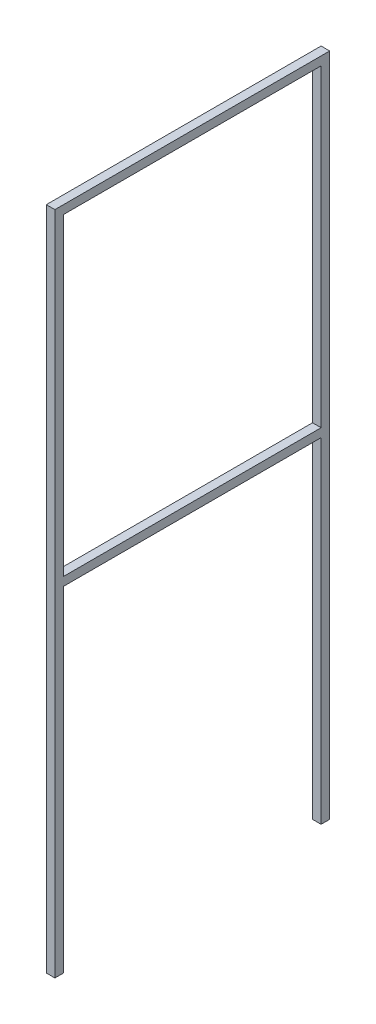
ISO-10303-21;
HEADER;
FILE_DESCRIPTION(('STEP AP214'),'2;1');
FILE_NAME('part.step','',(''),(''),'','','');
FILE_SCHEMA(('AUTOMOTIVE_DESIGN { 1 0 10303 214 1 1 1 1 }'));
ENDSEC;
DATA;
#1=APPLICATION_CONTEXT('core data for automotive mechanical design processes');
#2=APPLICATION_PROTOCOL_DEFINITION('international standard','automotive_design',2000,#1);
#3=PRODUCT_CONTEXT('',#1,'mechanical');
#4=PRODUCT('Part','Part','',(#3));
#5=PRODUCT_RELATED_PRODUCT_CATEGORY('part','',(#4));
#6=PRODUCT_DEFINITION_FORMATION('','',#4);
#7=PRODUCT_DEFINITION_CONTEXT('part definition',#1,'design');
#8=PRODUCT_DEFINITION('design','',#6,#7);
#9=PRODUCT_DEFINITION_SHAPE('','',#8);
#10=(LENGTH_UNIT() NAMED_UNIT(*) SI_UNIT(.MILLI.,.METRE.));
#11=(NAMED_UNIT(*) PLANE_ANGLE_UNIT() SI_UNIT($,.RADIAN.));
#12=(NAMED_UNIT(*) SI_UNIT($,.STERADIAN.) SOLID_ANGLE_UNIT());
#13=UNCERTAINTY_MEASURE_WITH_UNIT(LENGTH_MEASURE(1.E-05),#10,'distance_accuracy_value','');
#14=(GEOMETRIC_REPRESENTATION_CONTEXT(3) GLOBAL_UNCERTAINTY_ASSIGNED_CONTEXT((#13)) GLOBAL_UNIT_ASSIGNED_CONTEXT((#10,
#11,#12)) REPRESENTATION_CONTEXT('',''));
#15=CARTESIAN_POINT('',(0.,0.,0.));
#16=DIRECTION('',(0.,0.,1.));
#17=DIRECTION('',(1.,0.,0.));
#18=AXIS2_PLACEMENT_3D('',#15,#16,#17);
#19=CARTESIAN_POINT('',(20.,2.89623397728302E-13,600.));
#20=DIRECTION('',(0.,0.,-1.));
#21=DIRECTION('',(0.,1.,0.));
#22=AXIS2_PLACEMENT_3D('',#19,#20,#21);
#23=PLANE('',#22);
#24=DIRECTION('',(0.,-1.,0.));
#25=VECTOR('',#24,1.);
#26=CARTESIAN_POINT('',(0.,2.89623397728302E-13,600.));
#27=LINE('',#26,#25);
#28=CARTESIAN_POINT('',(0.,230.,600.));
#29=VERTEX_POINT('',#28);
#30=CARTESIAN_POINT('',(0.,-500.,600.));
#31=VERTEX_POINT('',#30);
#32=EDGE_CURVE('E178',#29,#31,#27,.T.);
#33=ORIENTED_EDGE('',*,*,#32,.F.);
#34=DIRECTION('',(-1.,0.,0.));
#35=VECTOR('',#34,1.);
#36=CARTESIAN_POINT('',(20.,230.,600.));
#37=LINE('',#36,#35);
#38=CARTESIAN_POINT('',(20.,230.,600.));
#39=VERTEX_POINT('',#38);
#40=EDGE_CURVE('E11',#39,#29,#37,.T.);
#41=ORIENTED_EDGE('',*,*,#40,.F.);
#42=DIRECTION('',(0.,-1.,0.));
#43=VECTOR('',#42,1.);
#44=CARTESIAN_POINT('',(20.,2.89623397728302E-13,600.));
#45=LINE('',#44,#43);
#46=CARTESIAN_POINT('',(20.,-500.,600.));
#47=VERTEX_POINT('',#46);
#48=EDGE_CURVE('E137',#39,#47,#45,.T.);
#49=ORIENTED_EDGE('',*,*,#48,.T.);
#50=DIRECTION('',(-1.,0.,0.));
#51=VECTOR('',#50,1.);
#52=CARTESIAN_POINT('',(20.,-500.,600.));
#53=LINE('',#52,#51);
#54=EDGE_CURVE('E99',#47,#31,#53,.T.);
#55=ORIENTED_EDGE('',*,*,#54,.T.);
#56=EDGE_LOOP('',(#33,#41,#49,#55));
#57=FACE_BOUND('',#56,.T.);
#58=ADVANCED_FACE('F34',(#57),#23,.T.);
#59=CARTESIAN_POINT('',(20.,230.,0.));
#60=DIRECTION('',(0.,1.,0.));
#61=DIRECTION('',(0.,0.,1.));
#62=AXIS2_PLACEMENT_3D('',#59,#60,#61);
#63=PLANE('',#62);
#64=DIRECTION('',(0.,0.,-1.));
#65=VECTOR('',#64,1.);
#66=CARTESIAN_POINT('',(0.,230.,0.));
#67=LINE('',#66,#65);
#68=CARTESIAN_POINT('',(0.,230.,0.));
#69=VERTEX_POINT('',#68);
#70=EDGE_CURVE('E143',#29,#69,#67,.T.);
#71=ORIENTED_EDGE('',*,*,#70,.T.);
#72=DIRECTION('',(-1.,0.,0.));
#73=VECTOR('',#72,1.);
#74=CARTESIAN_POINT('',(20.,230.,0.));
#75=LINE('',#74,#73);
#76=CARTESIAN_POINT('',(20.,230.,0.));
#77=VERTEX_POINT('',#76);
#78=EDGE_CURVE('E44',#77,#69,#75,.T.);
#79=ORIENTED_EDGE('',*,*,#78,.F.);
#80=DIRECTION('',(0.,0.,-1.));
#81=VECTOR('',#80,1.);
#82=CARTESIAN_POINT('',(20.,230.,0.));
#83=LINE('',#82,#81);
#84=EDGE_CURVE('E132',#39,#77,#83,.T.);
#85=ORIENTED_EDGE('',*,*,#84,.F.);
#86=ORIENTED_EDGE('',*,*,#40,.T.);
#87=EDGE_LOOP('',(#71,#79,#85,#86));
#88=FACE_BOUND('',#87,.T.);
#89=ADVANCED_FACE('F141',(#88),#63,.F.);
#90=CARTESIAN_POINT('',(20.,0.,0.));
#91=DIRECTION('',(0.,0.,1.));
#92=DIRECTION('',(1.,0.,0.));
#93=AXIS2_PLACEMENT_3D('',#90,#91,#92);
#94=PLANE('',#93);
#95=DIRECTION('',(0.,1.,0.));
#96=VECTOR('',#95,1.);
#97=CARTESIAN_POINT('',(0.,0.,0.));
#98=LINE('',#97,#96);
#99=CARTESIAN_POINT('',(0.,-500.,0.));
#100=VERTEX_POINT('',#99);
#101=EDGE_CURVE('E182',#100,#69,#98,.T.);
#102=ORIENTED_EDGE('',*,*,#101,.F.);
#103=DIRECTION('',(-1.,0.,0.));
#104=VECTOR('',#103,1.);
#105=CARTESIAN_POINT('',(20.,-500.,0.));
#106=LINE('',#105,#104);
#107=CARTESIAN_POINT('',(20.,-500.,0.));
#108=VERTEX_POINT('',#107);
#109=EDGE_CURVE('E92',#108,#100,#106,.T.);
#110=ORIENTED_EDGE('',*,*,#109,.F.);
#111=DIRECTION('',(0.,1.,0.));
#112=VECTOR('',#111,1.);
#113=CARTESIAN_POINT('',(20.,0.,0.));
#114=LINE('',#113,#112);
#115=EDGE_CURVE('E136',#108,#77,#114,.T.);
#116=ORIENTED_EDGE('',*,*,#115,.T.);
#117=ORIENTED_EDGE('',*,*,#78,.T.);
#118=EDGE_LOOP('',(#102,#110,#116,#117));
#119=FACE_BOUND('',#118,.T.);
#120=ADVANCED_FACE('F148',(#119),#94,.T.);
#121=CARTESIAN_POINT('',(20.,249.999999999999,-1.04083408558608E-12));
#122=DIRECTION('',(0.,1.,0.));
#123=DIRECTION('',(0.,0.,1.));
#124=AXIS2_PLACEMENT_3D('',#121,#122,#123);
#125=PLANE('',#124);
#126=DIRECTION('',(0.,0.,-1.));
#127=VECTOR('',#126,1.);
#128=CARTESIAN_POINT('',(0.,249.999999999999,-1.04083408558608E-12));
#129=LINE('',#128,#127);
#130=CARTESIAN_POINT('',(0.,250.,619.999999999999));
#131=VERTEX_POINT('',#130);
#132=CARTESIAN_POINT('',(0.,249.999999999999,-20.0000000000006));
#133=VERTEX_POINT('',#132);
#134=EDGE_CURVE('E154',#131,#133,#129,.T.);
#135=ORIENTED_EDGE('',*,*,#134,.F.);
#136=DIRECTION('',(-1.,0.,0.));
#137=VECTOR('',#136,1.);
#138=CARTESIAN_POINT('',(20.,250.,619.999999999999));
#139=LINE('',#138,#137);
#140=CARTESIAN_POINT('',(20.,250.,619.999999999999));
#141=VERTEX_POINT('',#140);
#142=EDGE_CURVE('E38',#141,#131,#139,.T.);
#143=ORIENTED_EDGE('',*,*,#142,.F.);
#144=DIRECTION('',(0.,0.,-1.));
#145=VECTOR('',#144,1.);
#146=CARTESIAN_POINT('',(20.,249.999999999999,-1.04083408558608E-12));
#147=LINE('',#146,#145);
#148=CARTESIAN_POINT('',(20.,249.999999999999,-20.0000000000006));
#149=VERTEX_POINT('',#148);
#150=EDGE_CURVE('E186',#141,#149,#147,.T.);
#151=ORIENTED_EDGE('',*,*,#150,.T.);
#152=DIRECTION('',(-1.,0.,0.));
#153=VECTOR('',#152,1.);
#154=CARTESIAN_POINT('',(20.,249.999999999999,-20.0000000000006));
#155=LINE('',#154,#153);
#156=EDGE_CURVE('E150',#149,#133,#155,.T.);
#157=ORIENTED_EDGE('',*,*,#156,.T.);
#158=EDGE_LOOP('',(#135,#143,#151,#157));
#159=FACE_BOUND('',#158,.T.);
#160=ADVANCED_FACE('F36',(#159),#125,.T.);
#161=CARTESIAN_POINT('',(20.,1.37667655053519E-12,620.));
#162=DIRECTION('',(0.,0.,-1.));
#163=DIRECTION('',(0.,1.,0.));
#164=AXIS2_PLACEMENT_3D('',#161,#162,#163);
#165=PLANE('',#164);
#166=DIRECTION('',(0.,-1.,0.));
#167=VECTOR('',#166,1.);
#168=CARTESIAN_POINT('',(0.,1.37667655053519E-12,620.));
#169=LINE('',#168,#167);
#170=CARTESIAN_POINT('',(0.,-1300.,620.));
#171=VERTEX_POINT('',#170);
#172=EDGE_CURVE('E157',#131,#171,#169,.T.);
#173=ORIENTED_EDGE('',*,*,#172,.T.);
#174=DIRECTION('',(-1.,0.,0.));
#175=VECTOR('',#174,1.);
#176=CARTESIAN_POINT('',(20.,-1300.,620.));
#177=LINE('',#176,#175);
#178=CARTESIAN_POINT('',(20.,-1300.,620.));
#179=VERTEX_POINT('',#178);
#180=EDGE_CURVE('E199',#179,#171,#177,.T.);
#181=ORIENTED_EDGE('',*,*,#180,.F.);
#182=DIRECTION('',(0.,-1.,0.));
#183=VECTOR('',#182,1.);
#184=CARTESIAN_POINT('',(20.,1.37667655053519E-12,620.));
#185=LINE('',#184,#183);
#186=EDGE_CURVE('E207',#141,#179,#185,.T.);
#187=ORIENTED_EDGE('',*,*,#186,.F.);
#188=ORIENTED_EDGE('',*,*,#142,.T.);
#189=EDGE_LOOP('',(#173,#181,#187,#188));
#190=FACE_BOUND('',#189,.T.);
#191=ADVANCED_FACE('F206',(#190),#165,.F.);
#192=CARTESIAN_POINT('',(20.,-1300.,0.));
#193=DIRECTION('',(0.,-1.,0.));
#194=DIRECTION('',(0.,0.,-1.));
#195=AXIS2_PLACEMENT_3D('',#192,#193,#194);
#196=PLANE('',#195);
#197=DIRECTION('',(0.,0.,1.));
#198=VECTOR('',#197,1.);
#199=CARTESIAN_POINT('',(0.,-1300.,0.));
#200=LINE('',#199,#198);
#201=CARTESIAN_POINT('',(0.,-1300.,600.));
#202=VERTEX_POINT('',#201);
#203=EDGE_CURVE('E160',#202,#171,#200,.T.);
#204=ORIENTED_EDGE('',*,*,#203,.F.);
#205=DIRECTION('',(-1.,0.,0.));
#206=VECTOR('',#205,1.);
#207=CARTESIAN_POINT('',(20.,-1300.,600.));
#208=LINE('',#207,#206);
#209=CARTESIAN_POINT('',(20.,-1300.,600.));
#210=VERTEX_POINT('',#209);
#211=EDGE_CURVE('E198',#210,#202,#208,.T.);
#212=ORIENTED_EDGE('',*,*,#211,.F.);
#213=DIRECTION('',(0.,0.,1.));
#214=VECTOR('',#213,1.);
#215=CARTESIAN_POINT('',(20.,-1300.,0.));
#216=LINE('',#215,#214);
#217=EDGE_CURVE('E393',#210,#179,#216,.T.);
#218=ORIENTED_EDGE('',*,*,#217,.T.);
#219=ORIENTED_EDGE('',*,*,#180,.T.);
#220=EDGE_LOOP('',(#204,#212,#218,#219));
#221=FACE_BOUND('',#220,.T.);
#222=ADVANCED_FACE('F243',(#221),#196,.T.);
#223=CARTESIAN_POINT('',(20.,-1.05735526154777E-13,600.));
#224=DIRECTION('',(0.,0.,-1.));
#225=DIRECTION('',(0.,1.,0.));
#226=AXIS2_PLACEMENT_3D('',#223,#224,#225);
#227=PLANE('',#226);
#228=DIRECTION('',(0.,-1.,0.));
#229=VECTOR('',#228,1.);
#230=CARTESIAN_POINT('',(0.,-1.05735526154777E-13,600.));
#231=LINE('',#230,#229);
#232=CARTESIAN_POINT('',(0.,-520.,600.));
#233=VERTEX_POINT('',#232);
#234=EDGE_CURVE('E163',#233,#202,#231,.T.);
#235=ORIENTED_EDGE('',*,*,#234,.F.);
#236=DIRECTION('',(-1.,0.,0.));
#237=VECTOR('',#236,1.);
#238=CARTESIAN_POINT('',(20.,-520.,600.));
#239=LINE('',#238,#237);
#240=CARTESIAN_POINT('',(20.,-520.,600.));
#241=VERTEX_POINT('',#240);
#242=EDGE_CURVE('E196',#241,#233,#239,.T.);
#243=ORIENTED_EDGE('',*,*,#242,.F.);
#244=DIRECTION('',(0.,-1.,0.));
#245=VECTOR('',#244,1.);
#246=CARTESIAN_POINT('',(20.,-1.05735526154777E-13,600.));
#247=LINE('',#246,#245);
#248=EDGE_CURVE('E241',#241,#210,#247,.T.);
#249=ORIENTED_EDGE('',*,*,#248,.T.);
#250=ORIENTED_EDGE('',*,*,#211,.T.);
#251=EDGE_LOOP('',(#235,#243,#249,#250));
#252=FACE_BOUND('',#251,.T.);
#253=ADVANCED_FACE('F238',(#252),#227,.T.);
#254=CARTESIAN_POINT('',(20.,-520.,0.));
#255=DIRECTION('',(0.,-1.,0.));
#256=DIRECTION('',(0.,0.,-1.));
#257=AXIS2_PLACEMENT_3D('',#254,#255,#256);
#258=PLANE('',#257);
#259=DIRECTION('',(0.,0.,1.));
#260=VECTOR('',#259,1.);
#261=CARTESIAN_POINT('',(0.,-520.,0.));
#262=LINE('',#261,#260);
#263=CARTESIAN_POINT('',(0.,-520.,0.));
#264=VERTEX_POINT('',#263);
#265=EDGE_CURVE('E166',#264,#233,#262,.T.);
#266=ORIENTED_EDGE('',*,*,#265,.F.);
#267=DIRECTION('',(-1.,0.,0.));
#268=VECTOR('',#267,1.);
#269=CARTESIAN_POINT('',(20.,-520.,0.));
#270=LINE('',#269,#268);
#271=CARTESIAN_POINT('',(20.,-520.,0.));
#272=VERTEX_POINT('',#271);
#273=EDGE_CURVE('E194',#272,#264,#270,.T.);
#274=ORIENTED_EDGE('',*,*,#273,.F.);
#275=DIRECTION('',(0.,0.,1.));
#276=VECTOR('',#275,1.);
#277=CARTESIAN_POINT('',(20.,-520.,0.));
#278=LINE('',#277,#276);
#279=EDGE_CURVE('E235',#272,#241,#278,.T.);
#280=ORIENTED_EDGE('',*,*,#279,.T.);
#281=ORIENTED_EDGE('',*,*,#242,.T.);
#282=EDGE_LOOP('',(#266,#274,#280,#281));
#283=FACE_BOUND('',#282,.T.);
#284=ADVANCED_FACE('F234',(#283),#258,.T.);
#285=CARTESIAN_POINT('',(20.,0.,-2.02066721859313E-13));
#286=DIRECTION('',(0.,0.,-1.));
#287=DIRECTION('',(0.,1.,0.));
#288=AXIS2_PLACEMENT_3D('',#285,#286,#287);
#289=PLANE('',#288);
#290=DIRECTION('',(0.,-1.,0.));
#291=VECTOR('',#290,1.);
#292=CARTESIAN_POINT('',(0.,0.,-2.02066721859313E-13));
#293=LINE('',#292,#291);
#294=CARTESIAN_POINT('',(0.,-1300.,-1.53080849955701E-13));
#295=VERTEX_POINT('',#294);
#296=EDGE_CURVE('E169',#264,#295,#293,.T.);
#297=ORIENTED_EDGE('',*,*,#296,.T.);
#298=DIRECTION('',(-1.,0.,0.));
#299=VECTOR('',#298,1.);
#300=CARTESIAN_POINT('',(20.,-1300.,-1.53080849955701E-13));
#301=LINE('',#300,#299);
#302=CARTESIAN_POINT('',(20.,-1300.,-1.53080849955701E-13));
#303=VERTEX_POINT('',#302);
#304=EDGE_CURVE('E192',#303,#295,#301,.T.);
#305=ORIENTED_EDGE('',*,*,#304,.F.);
#306=DIRECTION('',(0.,-1.,0.));
#307=VECTOR('',#306,1.);
#308=CARTESIAN_POINT('',(20.,0.,-2.02066721859313E-13));
#309=LINE('',#308,#307);
#310=EDGE_CURVE('E230',#272,#303,#309,.T.);
#311=ORIENTED_EDGE('',*,*,#310,.F.);
#312=ORIENTED_EDGE('',*,*,#273,.T.);
#313=EDGE_LOOP('',(#297,#305,#311,#312));
#314=FACE_BOUND('',#313,.T.);
#315=ADVANCED_FACE('F229',(#314),#289,.F.);
#316=CARTESIAN_POINT('',(20.,-1300.,0.));
#317=DIRECTION('',(0.,-1.,0.));
#318=DIRECTION('',(0.,0.,-1.));
#319=AXIS2_PLACEMENT_3D('',#316,#317,#318);
#320=PLANE('',#319);
#321=DIRECTION('',(0.,0.,1.));
#322=VECTOR('',#321,1.);
#323=CARTESIAN_POINT('',(0.,-1300.,0.));
#324=LINE('',#323,#322);
#325=CARTESIAN_POINT('',(0.,-1300.,-20.0000000000001));
#326=VERTEX_POINT('',#325);
#327=EDGE_CURVE('E172',#326,#295,#324,.T.);
#328=ORIENTED_EDGE('',*,*,#327,.F.);
#329=DIRECTION('',(-1.,0.,0.));
#330=VECTOR('',#329,1.);
#331=CARTESIAN_POINT('',(20.,-1300.,-20.0000000000001));
#332=LINE('',#331,#330);
#333=CARTESIAN_POINT('',(20.,-1300.,-20.0000000000001));
#334=VERTEX_POINT('',#333);
#335=EDGE_CURVE('E190',#334,#326,#332,.T.);
#336=ORIENTED_EDGE('',*,*,#335,.F.);
#337=DIRECTION('',(0.,0.,1.));
#338=VECTOR('',#337,1.);
#339=CARTESIAN_POINT('',(20.,-1300.,0.));
#340=LINE('',#339,#338);
#341=EDGE_CURVE('E226',#334,#303,#340,.T.);
#342=ORIENTED_EDGE('',*,*,#341,.T.);
#343=ORIENTED_EDGE('',*,*,#304,.T.);
#344=EDGE_LOOP('',(#328,#336,#342,#343));
#345=FACE_BOUND('',#344,.T.);
#346=ADVANCED_FACE('F222',(#345),#320,.T.);
#347=CARTESIAN_POINT('',(20.,0.,-20.));
#348=DIRECTION('',(0.,0.,-1.));
#349=DIRECTION('',(0.,1.,0.));
#350=AXIS2_PLACEMENT_3D('',#347,#348,#349);
#351=PLANE('',#350);
#352=DIRECTION('',(0.,-1.,0.));
#353=VECTOR('',#352,1.);
#354=CARTESIAN_POINT('',(0.,0.,-20.));
#355=LINE('',#354,#353);
#356=EDGE_CURVE('E175',#133,#326,#355,.T.);
#357=ORIENTED_EDGE('',*,*,#356,.F.);
#358=ORIENTED_EDGE('',*,*,#156,.F.);
#359=DIRECTION('',(0.,-1.,0.));
#360=VECTOR('',#359,1.);
#361=CARTESIAN_POINT('',(20.,0.,-20.));
#362=LINE('',#361,#360);
#363=EDGE_CURVE('E217',#149,#334,#362,.T.);
#364=ORIENTED_EDGE('',*,*,#363,.T.);
#365=ORIENTED_EDGE('',*,*,#335,.T.);
#366=EDGE_LOOP('',(#357,#358,#364,#365));
#367=FACE_BOUND('',#366,.T.);
#368=ADVANCED_FACE('F216',(#367),#351,.T.);
#369=CARTESIAN_POINT('',(20.,-500.,0.));
#370=DIRECTION('',(0.,-1.,0.));
#371=DIRECTION('',(0.,0.,-1.));
#372=AXIS2_PLACEMENT_3D('',#369,#370,#371);
#373=PLANE('',#372);
#374=DIRECTION('',(0.,0.,1.));
#375=VECTOR('',#374,1.);
#376=CARTESIAN_POINT('',(0.,-500.,0.));
#377=LINE('',#376,#375);
#378=EDGE_CURVE('E184',#100,#31,#377,.T.);
#379=ORIENTED_EDGE('',*,*,#378,.T.);
#380=ORIENTED_EDGE('',*,*,#54,.F.);
#381=DIRECTION('',(0.,0.,1.));
#382=VECTOR('',#381,1.);
#383=CARTESIAN_POINT('',(20.,-500.,0.));
#384=LINE('',#383,#382);
#385=EDGE_CURVE('E53',#108,#47,#384,.T.);
#386=ORIENTED_EDGE('',*,*,#385,.F.);
#387=ORIENTED_EDGE('',*,*,#109,.T.);
#388=EDGE_LOOP('',(#379,#380,#386,#387));
#389=FACE_BOUND('',#388,.T.);
#390=ADVANCED_FACE('F261',(#389),#373,.F.);
#391=CARTESIAN_POINT('',(20.,0.,0.));
#392=DIRECTION('',(1.,0.,0.));
#393=DIRECTION('',(0.,0.,-1.));
#394=AXIS2_PLACEMENT_3D('',#391,#392,#393);
#395=PLANE('',#394);
#396=ORIENTED_EDGE('',*,*,#150,.F.);
#397=ORIENTED_EDGE('',*,*,#186,.T.);
#398=ORIENTED_EDGE('',*,*,#217,.F.);
#399=ORIENTED_EDGE('',*,*,#248,.F.);
#400=ORIENTED_EDGE('',*,*,#279,.F.);
#401=ORIENTED_EDGE('',*,*,#310,.T.);
#402=ORIENTED_EDGE('',*,*,#341,.F.);
#403=ORIENTED_EDGE('',*,*,#363,.F.);
#404=EDGE_LOOP('',(#396,#397,#398,#399,#400,#401,#402,#403));
#405=FACE_BOUND('',#404,.T.);
#406=ORIENTED_EDGE('',*,*,#48,.F.);
#407=ORIENTED_EDGE('',*,*,#84,.T.);
#408=ORIENTED_EDGE('',*,*,#115,.F.);
#409=ORIENTED_EDGE('',*,*,#385,.T.);
#410=EDGE_LOOP('',(#406,#407,#408,#409));
#411=FACE_BOUND('',#410,.T.);
#412=ADVANCED_FACE('F134',(#405,#411),#395,.T.);
#413=CARTESIAN_POINT('',(0.,0.,0.));
#414=DIRECTION('',(1.,0.,0.));
#415=DIRECTION('',(0.,0.,-1.));
#416=AXIS2_PLACEMENT_3D('',#413,#414,#415);
#417=PLANE('',#416);
#418=ORIENTED_EDGE('',*,*,#134,.T.);
#419=ORIENTED_EDGE('',*,*,#356,.T.);
#420=ORIENTED_EDGE('',*,*,#327,.T.);
#421=ORIENTED_EDGE('',*,*,#296,.F.);
#422=ORIENTED_EDGE('',*,*,#265,.T.);
#423=ORIENTED_EDGE('',*,*,#234,.T.);
#424=ORIENTED_EDGE('',*,*,#203,.T.);
#425=ORIENTED_EDGE('',*,*,#172,.F.);
#426=EDGE_LOOP('',(#418,#419,#420,#421,#422,#423,#424,#425));
#427=FACE_BOUND('',#426,.T.);
#428=ORIENTED_EDGE('',*,*,#32,.T.);
#429=ORIENTED_EDGE('',*,*,#378,.F.);
#430=ORIENTED_EDGE('',*,*,#101,.T.);
#431=ORIENTED_EDGE('',*,*,#70,.F.);
#432=EDGE_LOOP('',(#428,#429,#430,#431));
#433=FACE_BOUND('',#432,.T.);
#434=ADVANCED_FACE('F210',(#427,#433),#417,.F.);
#435=CLOSED_SHELL('',(#58,#89,#120,#160,#191,#222,#253,#284,#315,#346,#368,#390,#412,#434));
#436=MANIFOLD_SOLID_BREP('B2',#435);
#437=ADVANCED_BREP_SHAPE_REPRESENTATION('',(#18,#436),#14);
#438=SHAPE_DEFINITION_REPRESENTATION(#9,#437);
ENDSEC;
END-ISO-10303-21;
